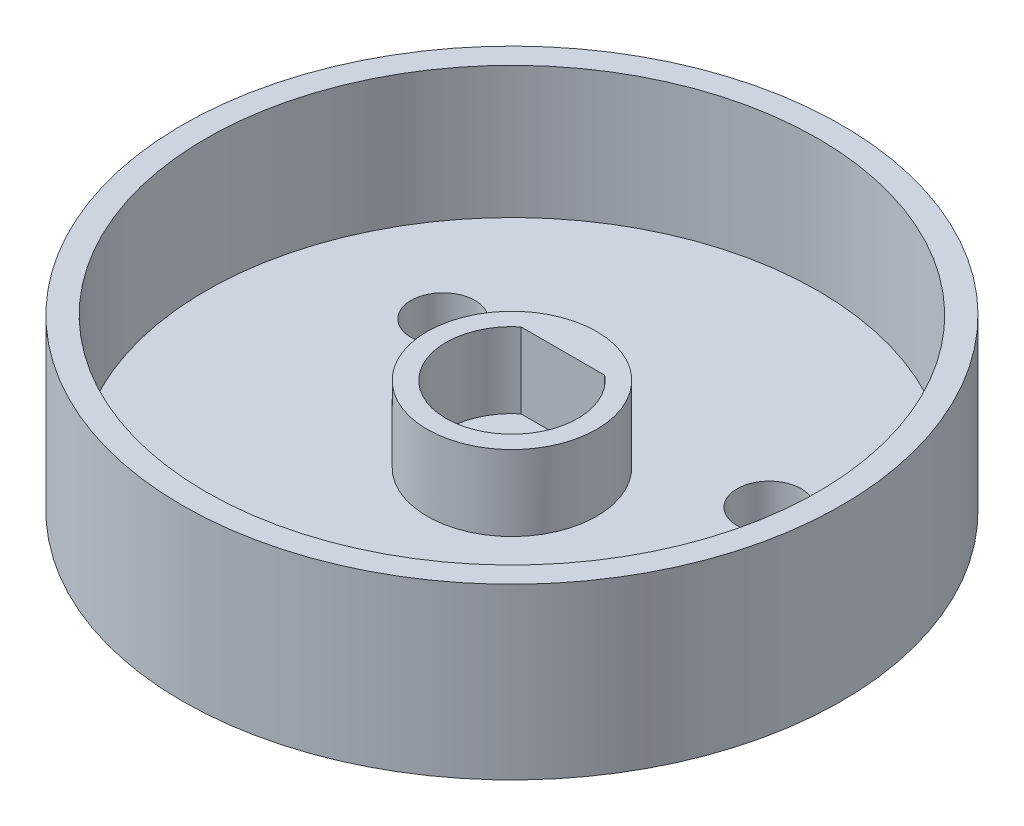
ISO-10303-21;
HEADER;
FILE_DESCRIPTION(('STEP AP214'),'2;1');
FILE_NAME('part.step','',(''),(''),'','','');
FILE_SCHEMA(('AUTOMOTIVE_DESIGN { 1 0 10303 214 1 1 1 1 }'));
ENDSEC;
DATA;
#1=APPLICATION_CONTEXT('core data for automotive mechanical design processes');
#2=APPLICATION_PROTOCOL_DEFINITION('international standard','automotive_design',2000,#1);
#3=PRODUCT_CONTEXT('',#1,'mechanical');
#4=PRODUCT('Part','Part','',(#3));
#5=PRODUCT_RELATED_PRODUCT_CATEGORY('part','',(#4));
#6=PRODUCT_DEFINITION_FORMATION('','',#4);
#7=PRODUCT_DEFINITION_CONTEXT('part definition',#1,'design');
#8=PRODUCT_DEFINITION('design','',#6,#7);
#9=PRODUCT_DEFINITION_SHAPE('','',#8);
#10=(LENGTH_UNIT() NAMED_UNIT(*) SI_UNIT(.MILLI.,.METRE.));
#11=(NAMED_UNIT(*) PLANE_ANGLE_UNIT() SI_UNIT($,.RADIAN.));
#12=(NAMED_UNIT(*) SI_UNIT($,.STERADIAN.) SOLID_ANGLE_UNIT());
#13=UNCERTAINTY_MEASURE_WITH_UNIT(LENGTH_MEASURE(1.E-05),#10,'distance_accuracy_value','');
#14=(GEOMETRIC_REPRESENTATION_CONTEXT(3) GLOBAL_UNCERTAINTY_ASSIGNED_CONTEXT((#13)) GLOBAL_UNIT_ASSIGNED_CONTEXT((#10,
#11,#12)) REPRESENTATION_CONTEXT('',''));
#15=CARTESIAN_POINT('',(0.,0.,0.));
#16=DIRECTION('',(0.,0.,1.));
#17=DIRECTION('',(1.,0.,0.));
#18=AXIS2_PLACEMENT_3D('',#15,#16,#17);
#19=CARTESIAN_POINT('',(150.,60.,45.));
#20=DIRECTION('',(0.,-1.,0.));
#21=DIRECTION('',(0.,0.,-1.));
#22=AXIS2_PLACEMENT_3D('',#19,#20,#21);
#23=PLANE('',#22);
#24=CARTESIAN_POINT('',(122.860187134882,60.,-9.87069024765072));
#25=DIRECTION('',(0.,-1.,0.));
#26=DIRECTION('',(0.,0.,-1.));
#27=AXIS2_PLACEMENT_3D('',#24,#25,#26);
#28=CIRCLE('',#27,3.4);
#29=CARTESIAN_POINT('',(122.860187134882,60.,-13.2706902476507));
#30=VERTEX_POINT('',#29);
#31=EDGE_CURVE('E179',#30,#30,#28,.T.);
#32=ORIENTED_EDGE('',*,*,#31,.T.);
#33=EDGE_LOOP('',(#32));
#34=FACE_BOUND('',#33,.T.);
#35=CARTESIAN_POINT('',(88.2191709835046,60.,-9.87069024765047));
#36=DIRECTION('',(0.,-1.,0.));
#37=DIRECTION('',(0.,0.,-1.));
#38=AXIS2_PLACEMENT_3D('',#35,#36,#37);
#39=CIRCLE('',#38,3.4);
#40=CARTESIAN_POINT('',(88.2191709835046,60.,-13.2706902476505));
#41=VERTEX_POINT('',#40);
#42=EDGE_CURVE('E181',#41,#41,#39,.T.);
#43=ORIENTED_EDGE('',*,*,#42,.T.);
#44=EDGE_LOOP('',(#43));
#45=FACE_BOUND('',#44,.T.);
#46=CARTESIAN_POINT('',(105.539679059193,60.,20.1293097523494));
#47=DIRECTION('',(0.,-1.,0.));
#48=DIRECTION('',(0.,0.,-1.));
#49=AXIS2_PLACEMENT_3D('',#46,#47,#48);
#50=CIRCLE('',#49,3.4);
#51=CARTESIAN_POINT('',(105.539679059193,60.,16.7293097523494));
#52=VERTEX_POINT('',#51);
#53=EDGE_CURVE('E147',#52,#52,#50,.T.);
#54=ORIENTED_EDGE('',*,*,#53,.T.);
#55=EDGE_LOOP('',(#54));
#56=FACE_BOUND('',#55,.T.);
#57=CARTESIAN_POINT('',(105.539679059193,60.,0.129309752349378));
#58=DIRECTION('',(0.,1.,0.));
#59=DIRECTION('',(0.,0.,1.));
#60=AXIS2_PLACEMENT_3D('',#57,#58,#59);
#61=CIRCLE('',#60,32.5);
#62=CARTESIAN_POINT('',(105.539679059193,60.,32.6293097523494));
#63=VERTEX_POINT('',#62);
#64=EDGE_CURVE('E96',#63,#63,#61,.T.);
#65=ORIENTED_EDGE('',*,*,#64,.T.);
#66=EDGE_LOOP('',(#65));
#67=FACE_BOUND('',#66,.T.);
#68=CARTESIAN_POINT('',(105.539679059193,60.,0.129309752349377));
#69=DIRECTION('',(0.,-1.,0.));
#70=DIRECTION('',(0.,0.,-1.));
#71=AXIS2_PLACEMENT_3D('',#68,#69,#70);
#72=CIRCLE('',#71,9.);
#73=CARTESIAN_POINT('',(105.539679059193,60.,-8.87069024765062));
#74=VERTEX_POINT('',#73);
#75=EDGE_CURVE('E12',#74,#74,#72,.F.);
#76=ORIENTED_EDGE('',*,*,#75,.F.);
#77=EDGE_LOOP('',(#76));
#78=FACE_BOUND('',#77,.T.);
#79=ADVANCED_FACE('F45',(#34,#45,#56,#67,#78),#23,.F.);
#80=CARTESIAN_POINT('',(150.,56.,-45.));
#81=DIRECTION('',(0.,1.,0.));
#82=DIRECTION('',(0.,0.,1.));
#83=AXIS2_PLACEMENT_3D('',#80,#81,#82);
#84=PLANE('',#83);
#85=CARTESIAN_POINT('',(122.860187134882,56.,-9.87069024765072));
#86=DIRECTION('',(0.,-1.,0.));
#87=DIRECTION('',(-0.866025403784436,0.,0.500000000000004));
#88=AXIS2_PLACEMENT_3D('',#85,#86,#87);
#89=CIRCLE('',#88,3.4);
#90=CARTESIAN_POINT('',(119.915700762015,56.,-8.17069024765071));
#91=VERTEX_POINT('',#90);
#92=EDGE_CURVE('E177',#91,#91,#89,.T.);
#93=ORIENTED_EDGE('',*,*,#92,.F.);
#94=EDGE_LOOP('',(#93));
#95=FACE_BOUND('',#94,.T.);
#96=CARTESIAN_POINT('',(88.2191709835046,56.,-9.87069024765047));
#97=DIRECTION('',(0.,-1.,0.));
#98=DIRECTION('',(0.866025403784443,0.,0.499999999999992));
#99=AXIS2_PLACEMENT_3D('',#96,#97,#98);
#100=CIRCLE('',#99,3.4);
#101=CARTESIAN_POINT('',(91.1636573563717,56.,-8.1706902476505));
#102=VERTEX_POINT('',#101);
#103=EDGE_CURVE('E198',#102,#102,#100,.T.);
#104=ORIENTED_EDGE('',*,*,#103,.F.);
#105=EDGE_LOOP('',(#104));
#106=FACE_BOUND('',#105,.T.);
#107=CARTESIAN_POINT('',(105.539679059193,56.,20.1293097523494));
#108=DIRECTION('',(0.,-1.,0.));
#109=DIRECTION('',(0.,0.,-1.));
#110=AXIS2_PLACEMENT_3D('',#107,#108,#109);
#111=CIRCLE('',#110,3.4);
#112=CARTESIAN_POINT('',(105.539679059193,56.,16.7293097523494));
#113=VERTEX_POINT('',#112);
#114=EDGE_CURVE('E180',#113,#113,#111,.T.);
#115=ORIENTED_EDGE('',*,*,#114,.F.);
#116=EDGE_LOOP('',(#115));
#117=FACE_BOUND('',#116,.T.);
#118=CARTESIAN_POINT('',(105.539679059193,56.,0.129309752349376));
#119=DIRECTION('',(0.,1.,0.));
#120=DIRECTION('',(0.,0.,1.));
#121=AXIS2_PLACEMENT_3D('',#118,#119,#120);
#122=CIRCLE('',#121,3.4);
#123=CARTESIAN_POINT('',(105.539679059193,56.,3.52930975234938));
#124=VERTEX_POINT('',#123);
#125=EDGE_CURVE('E49',#124,#124,#122,.T.);
#126=ORIENTED_EDGE('',*,*,#125,.T.);
#127=EDGE_LOOP('',(#126));
#128=FACE_BOUND('',#127,.T.);
#129=CARTESIAN_POINT('',(105.539679059193,56.,0.129309752349376));
#130=DIRECTION('',(0.,-1.,0.));
#131=DIRECTION('',(0.,0.,1.));
#132=AXIS2_PLACEMENT_3D('',#129,#130,#131);
#133=CIRCLE('',#132,35.);
#134=CARTESIAN_POINT('',(105.539679059193,56.,35.1293097523494));
#135=VERTEX_POINT('',#134);
#136=EDGE_CURVE('E144',#135,#135,#133,.T.);
#137=ORIENTED_EDGE('',*,*,#136,.T.);
#138=EDGE_LOOP('',(#137));
#139=FACE_BOUND('',#138,.T.);
#140=ADVANCED_FACE('F47',(#95,#106,#117,#128,#139),#84,.F.);
#141=CARTESIAN_POINT('',(105.539679059193,74.,0.129309752349378));
#142=DIRECTION('',(0.,1.,0.));
#143=DIRECTION('',(0.,0.,1.));
#144=AXIS2_PLACEMENT_3D('',#141,#142,#143);
#145=PLANE('',#144);
#146=CARTESIAN_POINT('',(105.539679059193,74.,0.129309752349378));
#147=DIRECTION('',(0.,1.,0.));
#148=DIRECTION('',(0.,0.,1.));
#149=AXIS2_PLACEMENT_3D('',#146,#147,#148);
#150=CIRCLE('',#149,35.);
#151=CARTESIAN_POINT('',(105.539679059193,74.,35.1293097523494));
#152=VERTEX_POINT('',#151);
#153=EDGE_CURVE('E54',#152,#152,#150,.T.);
#154=ORIENTED_EDGE('',*,*,#153,.T.);
#155=EDGE_LOOP('',(#154));
#156=FACE_BOUND('',#155,.T.);
#157=CARTESIAN_POINT('',(105.539679059193,74.,0.129309752349378));
#158=DIRECTION('',(0.,1.,0.));
#159=DIRECTION('',(0.,0.,1.));
#160=AXIS2_PLACEMENT_3D('',#157,#158,#159);
#161=CIRCLE('',#160,32.5);
#162=CARTESIAN_POINT('',(105.539679059193,74.,32.6293097523494));
#163=VERTEX_POINT('',#162);
#164=EDGE_CURVE('E97',#163,#163,#161,.T.);
#165=ORIENTED_EDGE('',*,*,#164,.F.);
#166=EDGE_LOOP('',(#165));
#167=FACE_BOUND('',#166,.T.);
#168=ADVANCED_FACE('F105',(#156,#167),#145,.T.);
#169=CARTESIAN_POINT('',(105.539679059193,74.,0.129309752349378));
#170=DIRECTION('',(0.,-1.,0.));
#171=DIRECTION('',(0.,0.,-1.));
#172=AXIS2_PLACEMENT_3D('',#169,#170,#171);
#173=CYLINDRICAL_SURFACE('',#172,35.);
#174=ORIENTED_EDGE('',*,*,#136,.F.);
#175=EDGE_LOOP('',(#174));
#176=FACE_BOUND('',#175,.T.);
#177=ORIENTED_EDGE('',*,*,#153,.F.);
#178=EDGE_LOOP('',(#177));
#179=FACE_BOUND('',#178,.T.);
#180=ADVANCED_FACE('F108',(#176,#179),#173,.T.);
#181=CARTESIAN_POINT('',(105.539679059193,74.,0.129309752349378));
#182=DIRECTION('',(0.,-1.,0.));
#183=DIRECTION('',(0.,0.,-1.));
#184=AXIS2_PLACEMENT_3D('',#181,#182,#183);
#185=CYLINDRICAL_SURFACE('',#184,32.5);
#186=ORIENTED_EDGE('',*,*,#164,.T.);
#187=EDGE_LOOP('',(#186));
#188=FACE_BOUND('',#187,.T.);
#189=ORIENTED_EDGE('',*,*,#64,.F.);
#190=EDGE_LOOP('',(#189));
#191=FACE_BOUND('',#190,.T.);
#192=ADVANCED_FACE('F110',(#188,#191),#185,.F.);
#193=CARTESIAN_POINT('',(105.539679059193,68.,0.129309752349377));
#194=DIRECTION('',(0.,1.,0.));
#195=DIRECTION('',(0.,0.,1.));
#196=AXIS2_PLACEMENT_3D('',#193,#194,#195);
#197=PLANE('',#196);
#198=CARTESIAN_POINT('',(105.539679059193,68.,0.129309752349377));
#199=DIRECTION('',(0.,1.,0.));
#200=DIRECTION('',(0.,0.,1.));
#201=AXIS2_PLACEMENT_3D('',#198,#199,#200);
#202=CIRCLE('',#201,9.);
#203=CARTESIAN_POINT('',(105.539679059193,68.,9.12930975234937));
#204=VERTEX_POINT('',#203);
#205=EDGE_CURVE('E83',#204,#204,#202,.T.);
#206=ORIENTED_EDGE('',*,*,#205,.T.);
#207=EDGE_LOOP('',(#206));
#208=FACE_BOUND('',#207,.T.);
#209=DIRECTION('',(-1.,0.,0.));
#210=VECTOR('',#209,1.);
#211=CARTESIAN_POINT('',(109.989679059193,68.,-5.27416135426348));
#212=LINE('',#211,#210);
#213=CARTESIAN_POINT('',(109.989679059193,68.,-5.27416135426348));
#214=VERTEX_POINT('',#213);
#215=CARTESIAN_POINT('',(101.089679059193,68.,-5.27416135426348));
#216=VERTEX_POINT('',#215);
#217=EDGE_CURVE('E90',#214,#216,#212,.T.);
#218=ORIENTED_EDGE('',*,*,#217,.F.);
#219=CARTESIAN_POINT('',(105.539679059193,68.,0.129309752349377));
#220=DIRECTION('',(0.,1.,0.));
#221=DIRECTION('',(0.,0.,1.));
#222=AXIS2_PLACEMENT_3D('',#219,#220,#221);
#223=CIRCLE('',#222,7.);
#224=EDGE_CURVE('E76',#216,#214,#223,.T.);
#225=ORIENTED_EDGE('',*,*,#224,.F.);
#226=EDGE_LOOP('',(#218,#225));
#227=FACE_BOUND('',#226,.T.);
#228=ADVANCED_FACE('F118',(#208,#227),#197,.T.);
#229=CARTESIAN_POINT('',(105.539679059193,68.,0.129309752349377));
#230=DIRECTION('',(0.,-1.,0.));
#231=DIRECTION('',(0.,0.,-1.));
#232=AXIS2_PLACEMENT_3D('',#229,#230,#231);
#233=CYLINDRICAL_SURFACE('',#232,9.);
#234=ORIENTED_EDGE('',*,*,#205,.F.);
#235=EDGE_LOOP('',(#234));
#236=FACE_BOUND('',#235,.T.);
#237=ORIENTED_EDGE('',*,*,#75,.T.);
#238=EDGE_LOOP('',(#237));
#239=FACE_BOUND('',#238,.T.);
#240=ADVANCED_FACE('F152',(#236,#239),#233,.T.);
#241=CARTESIAN_POINT('',(105.539679059193,68.,0.129309752349377));
#242=DIRECTION('',(0.,-1.,0.));
#243=DIRECTION('',(0.,0.,-1.));
#244=AXIS2_PLACEMENT_3D('',#241,#242,#243);
#245=CYLINDRICAL_SURFACE('',#244,7.);
#246=CARTESIAN_POINT('',(105.539679059193,60.,0.129309752349377));
#247=DIRECTION('',(0.,1.,0.));
#248=DIRECTION('',(0.,0.,1.));
#249=AXIS2_PLACEMENT_3D('',#246,#247,#248);
#250=CIRCLE('',#249,7.);
#251=CARTESIAN_POINT('',(101.089679059193,60.,-5.27416135426348));
#252=VERTEX_POINT('',#251);
#253=CARTESIAN_POINT('',(109.989679059193,60.,-5.27416135426348));
#254=VERTEX_POINT('',#253);
#255=EDGE_CURVE('E77',#252,#254,#250,.T.);
#256=ORIENTED_EDGE('',*,*,#255,.F.);
#257=DIRECTION('',(0.,-1.,0.));
#258=VECTOR('',#257,1.);
#259=CARTESIAN_POINT('',(101.089679059193,68.,-5.27416135426348));
#260=LINE('',#259,#258);
#261=EDGE_CURVE('E61',#216,#252,#260,.T.);
#262=ORIENTED_EDGE('',*,*,#261,.F.);
#263=ORIENTED_EDGE('',*,*,#224,.T.);
#264=DIRECTION('',(0.,-1.,0.));
#265=VECTOR('',#264,1.);
#266=CARTESIAN_POINT('',(109.989679059193,68.,-5.27416135426348));
#267=LINE('',#266,#265);
#268=EDGE_CURVE('E66',#214,#254,#267,.T.);
#269=ORIENTED_EDGE('',*,*,#268,.T.);
#270=EDGE_LOOP('',(#256,#262,#263,#269));
#271=FACE_BOUND('',#270,.T.);
#272=ADVANCED_FACE('F80',(#271),#245,.F.);
#273=CARTESIAN_POINT('',(109.989679059193,68.,-5.27416135426348));
#274=DIRECTION('',(0.,0.,1.));
#275=DIRECTION('',(0.,-1.,0.));
#276=AXIS2_PLACEMENT_3D('',#273,#274,#275);
#277=PLANE('',#276);
#278=DIRECTION('',(-1.,0.,0.));
#279=VECTOR('',#278,1.);
#280=CARTESIAN_POINT('',(109.989679059193,60.,-5.27416135426348));
#281=LINE('',#280,#279);
#282=EDGE_CURVE('E72',#254,#252,#281,.T.);
#283=ORIENTED_EDGE('',*,*,#282,.F.);
#284=ORIENTED_EDGE('',*,*,#268,.F.);
#285=ORIENTED_EDGE('',*,*,#217,.T.);
#286=ORIENTED_EDGE('',*,*,#261,.T.);
#287=EDGE_LOOP('',(#283,#284,#285,#286));
#288=FACE_BOUND('',#287,.T.);
#289=ADVANCED_FACE('F73',(#288),#277,.T.);
#290=CARTESIAN_POINT('',(105.539679059193,60.,0.129309752349377));
#291=DIRECTION('',(0.,1.,0.));
#292=DIRECTION('',(0.,0.,1.));
#293=AXIS2_PLACEMENT_3D('',#290,#291,#292);
#294=CIRCLE('',#293,3.4);
#295=CARTESIAN_POINT('',(105.539679059193,60.,3.52930975234938));
#296=VERTEX_POINT('',#295);
#297=EDGE_CURVE('E88',#296,#296,#294,.T.);
#298=ORIENTED_EDGE('',*,*,#297,.F.);
#299=EDGE_LOOP('',(#298));
#300=FACE_BOUND('',#299,.T.);
#301=ORIENTED_EDGE('',*,*,#282,.T.);
#302=ORIENTED_EDGE('',*,*,#255,.T.);
#303=EDGE_LOOP('',(#301,#302));
#304=FACE_BOUND('',#303,.T.);
#305=ADVANCED_FACE('F85',(#300,#304),#23,.F.);
#306=CARTESIAN_POINT('',(105.539679059193,46.,0.129309752349376));
#307=DIRECTION('',(0.,1.,0.));
#308=DIRECTION('',(0.,0.,1.));
#309=AXIS2_PLACEMENT_3D('',#306,#307,#308);
#310=CYLINDRICAL_SURFACE('',#309,3.4);
#311=ORIENTED_EDGE('',*,*,#297,.T.);
#312=EDGE_LOOP('',(#311));
#313=FACE_BOUND('',#312,.T.);
#314=ORIENTED_EDGE('',*,*,#125,.F.);
#315=EDGE_LOOP('',(#314));
#316=FACE_BOUND('',#315,.T.);
#317=ADVANCED_FACE('F133',(#313,#316),#310,.F.);
#318=CARTESIAN_POINT('',(105.539679059193,66.,20.1293097523494));
#319=DIRECTION('',(0.,-1.,0.));
#320=DIRECTION('',(0.,0.,-1.));
#321=AXIS2_PLACEMENT_3D('',#318,#319,#320);
#322=CYLINDRICAL_SURFACE('',#321,3.4);
#323=ORIENTED_EDGE('',*,*,#114,.T.);
#324=EDGE_LOOP('',(#323));
#325=FACE_BOUND('',#324,.T.);
#326=ORIENTED_EDGE('',*,*,#53,.F.);
#327=EDGE_LOOP('',(#326));
#328=FACE_BOUND('',#327,.T.);
#329=ADVANCED_FACE('F138',(#325,#328),#322,.F.);
#330=CARTESIAN_POINT('',(88.2191709835046,66.,-9.87069024765047));
#331=DIRECTION('',(0.,-1.,0.));
#332=DIRECTION('',(0.,0.,-1.));
#333=AXIS2_PLACEMENT_3D('',#330,#331,#332);
#334=CYLINDRICAL_SURFACE('',#333,3.4);
#335=ORIENTED_EDGE('',*,*,#103,.T.);
#336=EDGE_LOOP('',(#335));
#337=FACE_BOUND('',#336,.T.);
#338=ORIENTED_EDGE('',*,*,#42,.F.);
#339=EDGE_LOOP('',(#338));
#340=FACE_BOUND('',#339,.T.);
#341=ADVANCED_FACE('F164',(#337,#340),#334,.F.);
#342=CARTESIAN_POINT('',(122.860187134882,66.,-9.87069024765072));
#343=DIRECTION('',(0.,-1.,0.));
#344=DIRECTION('',(0.,0.,-1.));
#345=AXIS2_PLACEMENT_3D('',#342,#343,#344);
#346=CYLINDRICAL_SURFACE('',#345,3.4);
#347=ORIENTED_EDGE('',*,*,#92,.T.);
#348=EDGE_LOOP('',(#347));
#349=FACE_BOUND('',#348,.T.);
#350=ORIENTED_EDGE('',*,*,#31,.F.);
#351=EDGE_LOOP('',(#350));
#352=FACE_BOUND('',#351,.T.);
#353=ADVANCED_FACE('F168',(#349,#352),#346,.F.);
#354=CLOSED_SHELL('',(#79,#140,#168,#180,#192,#228,#240,#272,#289,#305,#317,#329,#341,#353));
#355=MANIFOLD_SOLID_BREP('B2',#354);
#356=ADVANCED_BREP_SHAPE_REPRESENTATION('',(#18,#355),#14);
#357=SHAPE_DEFINITION_REPRESENTATION(#9,#356);
ENDSEC;
END-ISO-10303-21;
